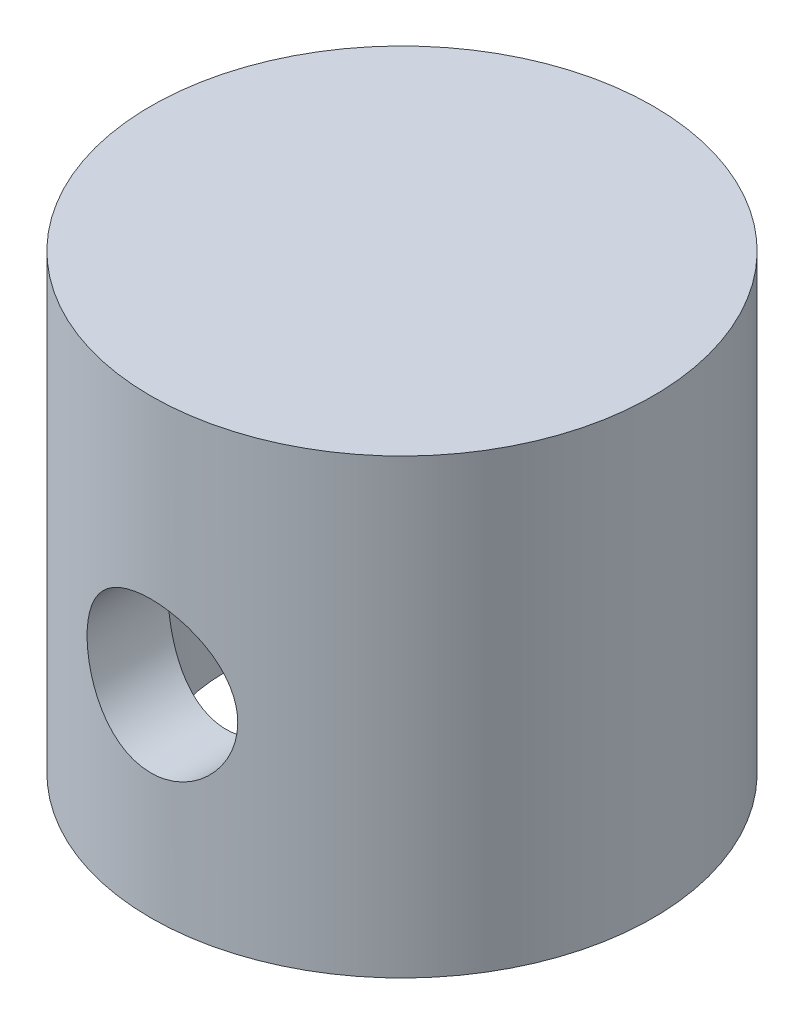
ISO-10303-21;
HEADER;
FILE_DESCRIPTION(('STEP AP214'),'2;1');
FILE_NAME('part.step','',(''),(''),'','','');
FILE_SCHEMA(('AUTOMOTIVE_DESIGN { 1 0 10303 214 1 1 1 1 }'));
ENDSEC;
DATA;
#1=APPLICATION_CONTEXT('core data for automotive mechanical design processes');
#2=APPLICATION_PROTOCOL_DEFINITION('international standard','automotive_design',2000,#1);
#3=PRODUCT_CONTEXT('',#1,'mechanical');
#4=PRODUCT('Part','Part','',(#3));
#5=PRODUCT_RELATED_PRODUCT_CATEGORY('part','',(#4));
#6=PRODUCT_DEFINITION_FORMATION('','',#4);
#7=PRODUCT_DEFINITION_CONTEXT('part definition',#1,'design');
#8=PRODUCT_DEFINITION('design','',#6,#7);
#9=PRODUCT_DEFINITION_SHAPE('','',#8);
#10=(LENGTH_UNIT() NAMED_UNIT(*) SI_UNIT(.MILLI.,.METRE.));
#11=(NAMED_UNIT(*) PLANE_ANGLE_UNIT() SI_UNIT($,.RADIAN.));
#12=(NAMED_UNIT(*) SI_UNIT($,.STERADIAN.) SOLID_ANGLE_UNIT());
#13=UNCERTAINTY_MEASURE_WITH_UNIT(LENGTH_MEASURE(1.E-05),#10,'distance_accuracy_value','');
#14=(GEOMETRIC_REPRESENTATION_CONTEXT(3) GLOBAL_UNCERTAINTY_ASSIGNED_CONTEXT((#13)) GLOBAL_UNIT_ASSIGNED_CONTEXT((#10,
#11,#12)) REPRESENTATION_CONTEXT('',''));
#15=CARTESIAN_POINT('',(0.,0.,0.));
#16=DIRECTION('',(0.,0.,1.));
#17=DIRECTION('',(1.,0.,0.));
#18=AXIS2_PLACEMENT_3D('',#15,#16,#17);
#19=CARTESIAN_POINT('',(0.,18.,0.));
#20=DIRECTION('',(0.,-1.,0.));
#21=DIRECTION('',(0.,0.,-1.));
#22=AXIS2_PLACEMENT_3D('',#19,#20,#21);
#23=CYLINDRICAL_SURFACE('',#22,10.);
#24=CARTESIAN_POINT('',(0.,11.,-10.));
#25=CARTESIAN_POINT('',(-0.1645772255066,10.9999980050302,-9.999998585011));
#26=CARTESIAN_POINT('',(-0.329174636703059,10.9864122727521,-9.99589831387907));
#27=CARTESIAN_POINT('',(-0.653576250609762,10.9325572915558,-9.97994211187381));
#28=CARTESIAN_POINT('',(-0.81337900882284,10.8922800839533,-9.96808386779384));
#29=CARTESIAN_POINT('',(-1.12346541550905,10.7865079661795,-9.93791105003673));
#30=CARTESIAN_POINT('',(-1.27376272879075,10.7210502607621,-9.91960600500851));
#31=CARTESIAN_POINT('',(-1.56124836210626,10.5669278138883,-9.8784421847529));
#32=CARTESIAN_POINT('',(-1.69843493493934,10.4782599852092,-9.85558280384133));
#33=CARTESIAN_POINT('',(-1.95974359436749,10.2775519850547,-9.80701474385548));
#34=CARTESIAN_POINT('',(-2.08343614248868,10.1649667482282,-9.78124767314073));
#35=CARTESIAN_POINT('',(-2.31049841846647,9.92078154017963,-9.73011668420884));
#36=CARTESIAN_POINT('',(-2.41386472654882,9.78917837575008,-9.70475283449002));
#37=CARTESIAN_POINT('',(-2.59960075447415,9.50705849392478,-9.65668227987544));
#38=CARTESIAN_POINT('',(-2.68144618044427,9.35618307801853,-9.63404813327749));
#39=CARTESIAN_POINT('',(-2.81842789549521,9.04202149153942,-9.59487240788062));
#40=CARTESIAN_POINT('',(-2.87357059839947,8.87873831214405,-9.57832936626621));
#41=CARTESIAN_POINT('',(-2.95403267365303,8.54921946773908,-9.55381741676868));
#42=CARTESIAN_POINT('',(-2.98014392469355,8.38319451227211,-9.54562138649066));
#43=CARTESIAN_POINT('',(-3.00427461229344,8.04893368756647,-9.53805579499534));
#44=CARTESIAN_POINT('',(-3.00230085522157,7.88069836388182,-9.53868409521142));
#45=CARTESIAN_POINT('',(-2.97093954399623,7.55323218278303,-9.54849488135555));
#46=CARTESIAN_POINT('',(-2.9425441052537,7.39389549927552,-9.55736777198281));
#47=CARTESIAN_POINT('',(-2.86074840854112,7.08236042745308,-9.58216712457248));
#48=CARTESIAN_POINT('',(-2.80734568283282,6.93016274525133,-9.59809428264701));
#49=CARTESIAN_POINT('',(-2.67632053307363,6.63479930067852,-9.63545466149946));
#50=CARTESIAN_POINT('',(-2.59837633869285,6.49178583208948,-9.65696032231904));
#51=CARTESIAN_POINT('',(-2.42070445177367,6.22053595597962,-9.70301974000129));
#52=CARTESIAN_POINT('',(-2.32097148005177,6.09230314117245,-9.72757423493982));
#53=CARTESIAN_POINT('',(-2.09762581531093,5.84862761847596,-9.77822022595874));
#54=CARTESIAN_POINT('',(-1.97318981493395,5.73394267194066,-9.80433308620995));
#55=CARTESIAN_POINT('',(-1.70652651862793,5.5268920318715,-9.85424488126517));
#56=CARTESIAN_POINT('',(-1.56429810372178,5.43452774317115,-9.8780436703682));
#57=CARTESIAN_POINT('',(-1.26471007668561,5.27428015507054,-9.92086320138941));
#58=CARTESIAN_POINT('',(-1.1072554994959,5.20656496750028,-9.93985087336628));
#59=CARTESIAN_POINT('',(-0.782490831207038,5.09880081980074,-9.97067043664444));
#60=CARTESIAN_POINT('',(-0.615183503179163,5.05874414293502,-9.98250432373999));
#61=CARTESIAN_POINT('',(-0.281904485336663,5.00869564420121,-9.99736729287077));
#62=CARTESIAN_POINT('',(-0.116100195202373,4.99767682839678,-10.0006970083558));
#63=CARTESIAN_POINT('',(0.214999211646767,5.00313831142416,-9.99905846483519));
#64=CARTESIAN_POINT('',(0.380294393381562,5.01961493930288,-9.99409131355514));
#65=CARTESIAN_POINT('',(0.701807210619394,5.07876922222299,-9.97661393974324));
#66=CARTESIAN_POINT('',(0.858145545228338,5.12084677516174,-9.96427659598828));
#67=CARTESIAN_POINT('',(1.16150927790904,5.2292864655564,-9.9334869568307));
#68=CARTESIAN_POINT('',(1.30853355405117,5.29565152207572,-9.91503392642187));
#69=CARTESIAN_POINT('',(1.5928743789221,5.45250633096227,-9.87339308702631));
#70=CARTESIAN_POINT('',(1.72988765239934,5.54351868189596,-9.8501056165928));
#71=CARTESIAN_POINT('',(1.9870466159603,5.74644950810561,-9.80146937528704));
#72=CARTESIAN_POINT('',(2.10718806471188,5.8583732237753,-9.77612008862419));
#73=CARTESIAN_POINT('',(2.33171489102052,6.10477461673874,-9.72506343738006));
#74=CARTESIAN_POINT('',(2.43536962463001,6.23992375154365,-9.69937650065513));
#75=CARTESIAN_POINT('',(2.61857990144313,6.52625587802689,-9.65153030477949));
#76=CARTESIAN_POINT('',(2.69813607658965,6.67743844911576,-9.62937095313121));
#77=CARTESIAN_POINT('',(2.83034694254316,6.99106498251004,-9.5913437922631));
#78=CARTESIAN_POINT('',(2.88312693874022,7.15345237307567,-9.575446756735));
#79=CARTESIAN_POINT('',(2.96043461630306,7.48537593786047,-9.55183188739737));
#80=CARTESIAN_POINT('',(2.98497197957849,7.65490964156607,-9.54411125069387));
#81=CARTESIAN_POINT('',(3.0044396896993,7.98872303677684,-9.53799944941558));
#82=CARTESIAN_POINT('',(3.00056110615887,8.15292730209885,-9.53923294700394));
#83=CARTESIAN_POINT('',(2.9661501088861,8.47822820680123,-9.54998802392188));
#84=CARTESIAN_POINT('',(2.93561876249407,8.63932497036103,-9.55950927135902));
#85=CARTESIAN_POINT('',(2.84953777608686,8.95189079826335,-9.58551527389243));
#86=CARTESIAN_POINT('',(2.79430351014248,9.10345457471739,-9.60191209104934));
#87=CARTESIAN_POINT('',(2.66063014242147,9.39528487764145,-9.63980557805265));
#88=CARTESIAN_POINT('',(2.58218659925722,9.53554923528315,-9.6613032238508));
#89=CARTESIAN_POINT('',(2.40097527610175,9.80632623305253,-9.70795352855338));
#90=CARTESIAN_POINT('',(2.29742552185996,9.93629752252037,-9.7332108032858));
#91=CARTESIAN_POINT('',(2.07034869259555,10.1774049966162,-9.78402640899066));
#92=CARTESIAN_POINT('',(1.94681643426898,10.2885362789356,-9.80958481647543));
#93=CARTESIAN_POINT('',(1.67893152436652,10.4920468245899,-9.85901873141573));
#94=CARTESIAN_POINT('',(1.53407577158122,10.5837828937109,-9.88282319531421));
#95=CARTESIAN_POINT('',(1.23028274796705,10.7414703398081,-9.92521360911553));
#96=CARTESIAN_POINT('',(1.07135210599791,10.807433776549,-9.94380199862114));
#97=CARTESIAN_POINT('',(0.761515425310563,10.9057905513055,-9.97204349938618));
#98=CARTESIAN_POINT('',(0.611573923908468,10.9410233457665,-9.98244054762139));
#99=CARTESIAN_POINT('',(0.307760390461558,10.9881270504832,-9.9964188898898));
#100=CARTESIAN_POINT('',(0.153889019716279,11.0000018654096,-10.0000013230948));
#101=CARTESIAN_POINT('',(0.,11.,-10.));
#102=B_SPLINE_CURVE_WITH_KNOTS('',3,(#24,#25,#26,#27,#28,#29,#30,#31,#32,#33,#34,#35,#36,#37,
#38,#39,#40,#41,#42,#43,#44,#45,#46,#47,#48,#49,#50,#51,#52,#53,#54,#55,#56,#57,#58,#59,#60,#61,
#62,#63,#64,#65,#66,#67,#68,#69,#70,#71,#72,#73,#74,#75,#76,#77,#78,#79,#80,#81,#82,#83,#84,#85,
#86,#87,#88,#89,#90,#91,#92,#93,#94,#95,#96,#97,#98,#99,#100,#101),.UNSPECIFIED.,.T.,.F.,(4,2,2,
2,2,2,2,2,2,2,2,2,2,2,2,2,2,2,2,2,2,2,2,2,2,2,2,2,2,2,2,2,2,2,2,2,2,2,4),(0.,0.493166407225221,
0.986479929691999,1.47906735260175,1.9717203288254,2.47711205896383,2.98258874577266,
3.49942962008218,4.01614629086447,4.51839378713198,5.02051956638179,5.50452033395352,
5.98856887316002,6.47924852894239,6.97004720317111,7.48134208096333,7.99266913062143,
8.50742093763377,9.02202907057615,9.5181761887709,10.0142570710065,10.4991349336465,
10.9840710918746,11.4802261140582,11.9765056400038,12.4908080064564,13.0050968850536,
13.516956299025,14.0286401892057,14.5190031093854,15.0093463933232,15.4936008081456,
15.9779479511534,16.4799385136898,16.9820594980413,17.4988599232246,18.0154182319959,
18.4766338387004,18.9377723390687),.UNSPECIFIED.);
#103=CARTESIAN_POINT('',(0.,11.,-10.));
#104=VERTEX_POINT('',#103);
#105=EDGE_CURVE('E99',#104,#104,#102,.T.);
#106=ORIENTED_EDGE('',*,*,#105,.T.);
#107=EDGE_LOOP('',(#106));
#108=FACE_BOUND('',#107,.T.);
#109=CARTESIAN_POINT('',(3.,8.,9.53939201416945));
#110=CARTESIAN_POINT('',(2.99999795267528,7.83561090411519,9.5393937145396));
#111=CARTESIAN_POINT('',(2.98644216334284,7.67120155171195,9.54368780418137));
#112=CARTESIAN_POINT('',(2.93271688893498,7.34718950081611,9.56033156605799));
#113=CARTESIAN_POINT('',(2.89253851147156,7.18758842699707,9.57268392986936));
#114=CARTESIAN_POINT('',(2.78705506539911,6.87793054345654,9.60392204971265));
#115=CARTESIAN_POINT('',(2.72179178788487,6.72785834073383,9.62279693406464));
#116=CARTESIAN_POINT('',(2.56812843835858,6.4407561320094,9.66493865095134));
#117=CARTESIAN_POINT('',(2.47972490274105,6.30372808263112,9.68820614082039));
#118=CARTESIAN_POINT('',(2.27929508283254,6.04226721884525,9.73733724371531));
#119=CARTESIAN_POINT('',(2.16666414351613,5.91830820410743,9.76325616623271));
#120=CARTESIAN_POINT('',(1.9222724751592,5.69072409735498,9.81429723873514));
#121=CARTESIAN_POINT('',(1.79050929092222,5.58710161910024,9.8394192859541));
#122=CARTESIAN_POINT('',(1.50822287558738,5.40107460033339,9.88666429158777));
#123=CARTESIAN_POINT('',(1.35736804267163,5.31915315111438,9.90871448684808));
#124=CARTESIAN_POINT('',(1.04324929073871,5.18202548191449,9.94668871841369));
#125=CARTESIAN_POINT('',(0.879988056775823,5.1268135002851,9.96261407578991));
#126=CARTESIAN_POINT('',(0.55064770526166,5.04623999781898,9.98615292007177));
#127=CARTESIAN_POINT('',(0.384782797907604,5.02006974469459,9.99399114738673));
#128=CARTESIAN_POINT('',(0.0508436474986284,4.99576535070712,10.001264030027));
#129=CARTESIAN_POINT('',(-0.117230124100743,4.99762532119609,10.0007004504217));
#130=CARTESIAN_POINT('',(-0.445142313200314,5.02878573708604,9.99139207635305));
#131=CARTESIAN_POINT('',(-0.60507253528266,5.0572103876197,9.98290840410475));
#132=CARTESIAN_POINT('',(-0.917778426885076,5.13926267198862,9.95903044225231));
#133=CARTESIAN_POINT('',(-1.07055364264578,5.1928919018855,9.9436357150134));
#134=CARTESIAN_POINT('',(-1.36669465270248,5.32442404683696,9.90730441973756));
#135=CARTESIAN_POINT('',(-1.50993012938864,5.40260240561395,9.88630539352772));
#136=CARTESIAN_POINT('',(-1.78152934756663,5.58079570485705,9.84099281296777));
#137=CARTESIAN_POINT('',(-1.90988954974545,5.68081582592917,9.81667847277943));
#138=CARTESIAN_POINT('',(-2.15332096305837,5.9043955015009,9.76623100973852));
#139=CARTESIAN_POINT('',(-2.26768916079755,6.02871383805078,9.74006390633502));
#140=CARTESIAN_POINT('',(-2.47415303080115,6.2950200357888,9.68967959784414));
#141=CARTESIAN_POINT('',(-2.56624648967452,6.43700965081097,9.66546258669242));
#142=CARTESIAN_POINT('',(-2.72627990669511,6.73647893847217,9.62155806359712));
#143=CARTESIAN_POINT('',(-2.79397978469378,6.89409409161749,9.6019162125849));
#144=CARTESIAN_POINT('',(-2.90166725750739,7.2192144167786,9.5699278496379));
#145=CARTESIAN_POINT('',(-2.94166389279494,7.38671634303506,9.55757895796639));
#146=CARTESIAN_POINT('',(-2.99149540565762,7.72016472150244,9.54209699116239));
#147=CARTESIAN_POINT('',(-3.00239892760807,7.88593644779436,9.53863757349917));
#148=CARTESIAN_POINT('',(-2.99671894465741,8.21694580001334,9.54042384874812));
#149=CARTESIAN_POINT('',(-2.98013928742559,8.38218349746,9.54566832310786));
#150=CARTESIAN_POINT('',(-2.92091527148479,8.70297675594339,9.56395117112153));
#151=CARTESIAN_POINT('',(-2.87895922862587,8.85867232852749,9.57678353015602));
#152=CARTESIAN_POINT('',(-2.77097155495853,9.16080338162939,9.6085828246183));
#153=CARTESIAN_POINT('',(-2.70493620685512,9.30723742828102,9.62755070717977));
#154=CARTESIAN_POINT('',(-2.54863742393008,9.59103492814438,9.67011670046268));
#155=CARTESIAN_POINT('',(-2.4577712834546,9.72804944197162,9.69382542139644));
#156=CARTESIAN_POINT('',(-2.25510603200767,9.98527621236157,9.74296411293927));
#157=CARTESIAN_POINT('',(-2.14330191069793,10.1054844352256,9.76839449459993));
#158=CARTESIAN_POINT('',(-1.8969102649872,10.3303608116295,9.81927267096329));
#159=CARTESIAN_POINT('',(-1.76162213171487,10.434271257974,9.84468490126011));
#160=CARTESIAN_POINT('',(-1.4749235691805,10.6179334020555,9.89169703497297));
#161=CARTESIAN_POINT('',(-1.32351394108789,10.6976862995629,9.91329712769433));
#162=CARTESIAN_POINT('',(-1.00987100941044,10.8300000611366,9.95011940949915));
#163=CARTESIAN_POINT('',(-0.847729244075677,10.882764032318,9.96538906849931));
#164=CARTESIAN_POINT('',(-0.516339933009175,10.9601218377808,9.98803959193653));
#165=CARTESIAN_POINT('',(-0.347094434709525,10.9847237318968,9.9954227134176));
#166=CARTESIAN_POINT('',(-0.0133043077654862,11.004446088109,10.001330881628));
#167=CARTESIAN_POINT('',(0.151170358172413,11.0006653908157,10.0001861022264));
#168=CARTESIAN_POINT('',(0.477038962328807,10.9663567350018,9.98994528930073));
#169=CARTESIAN_POINT('',(0.638433074693057,10.9358302930391,9.98084970660925));
#170=CARTESIAN_POINT('',(0.951871626082716,10.8495766772007,9.95582336716653));
#171=CARTESIAN_POINT('',(1.10399785470278,10.794123638702,9.93996705801731));
#172=CARTESIAN_POINT('',(1.39686647550411,10.6598361709856,9.90305886078899));
#173=CARTESIAN_POINT('',(1.53760699210116,10.5809978994276,9.88200611899892));
#174=CARTESIAN_POINT('',(1.80860378484113,10.3992530851399,9.83607931656456));
#175=CARTESIAN_POINT('',(1.93838050015353,10.2956571399985,9.81110453847118));
#176=CARTESIAN_POINT('',(2.17907514269189,10.0685792233344,9.76047074424667));
#177=CARTESIAN_POINT('',(2.28998761920387,9.9450915242037,9.73481153282158));
#178=CARTESIAN_POINT('',(2.49312538789097,9.67731844337898,9.68481361262638));
#179=CARTESIAN_POINT('',(2.58469519515913,9.53252289321913,9.6605370538697));
#180=CARTESIAN_POINT('',(2.74208627057551,9.22888965167796,9.61705095017586));
#181=CARTESIAN_POINT('',(2.80791991114577,9.07005875279761,9.59783897193911));
#182=CARTESIAN_POINT('',(2.90603885065899,8.76051913678745,9.56855633435189));
#183=CARTESIAN_POINT('',(2.94117718022463,8.61078270613801,9.5577230968104));
#184=CARTESIAN_POINT('',(2.98815637670288,8.30736955500845,9.54314085194333));
#185=CARTESIAN_POINT('',(3.00000191412191,8.1536936307095,9.53939042442861));
#186=CARTESIAN_POINT('',(3.,8.,9.53939201416945));
#187=B_SPLINE_CURVE_WITH_KNOTS('',3,(#109,#110,#111,#112,#113,#114,#115,#116,#117,#118,#119,
#120,#121,#122,#123,#124,#125,#126,#127,#128,#129,#130,#131,#132,#133,#134,#135,#136,#137,#138,
#139,#140,#141,#142,#143,#144,#145,#146,#147,#148,#149,#150,#151,#152,#153,#154,#155,#156,#157,
#158,#159,#160,#161,#162,#163,#164,#165,#166,#167,#168,#169,#170,#171,#172,#173,#174,#175,#176,
#177,#178,#179,#180,#181,#182,#183,#184,#185,#186),.UNSPECIFIED.,.T.,.F.,(4,2,2,2,2,2,2,2,2,2,2,
2,2,2,2,2,2,2,2,2,2,2,2,2,2,2,2,2,2,2,2,2,2,2,2,2,2,2,4),(0.,0.492600331831084,
0.985365283377999,1.47731282893239,1.9693340507402,2.47546300015968,2.98165695742546,
3.49831878547289,4.01486911175754,4.51664280299115,5.01831108202881,5.5040025198176,
5.98972471780752,6.48110418671353,6.97260033181661,7.48304294046556,7.99353624983726,
8.50892476494934,9.02414501262032,9.52016161585828,10.0161087821998,10.4991718988284,
10.9823096209678,11.4784146362399,11.9746385186305,12.4895901220641,13.0045161465361,
13.5155078363386,14.0263532464857,14.5175260782765,15.0086710610072,15.4945419374965,
15.9804926898797,16.4819925411419,16.9836370526499,17.500232793435,18.016579879331,
18.477223077201,18.9377739007233),.UNSPECIFIED.);
#188=CARTESIAN_POINT('',(3.,8.,9.53939201416945));
#189=VERTEX_POINT('',#188);
#190=EDGE_CURVE('E74',#189,#189,#187,.T.);
#191=ORIENTED_EDGE('',*,*,#190,.T.);
#192=EDGE_LOOP('',(#191));
#193=FACE_BOUND('',#192,.T.);
#194=CARTESIAN_POINT('',(0.,18.,0.));
#195=DIRECTION('',(0.,1.,0.));
#196=DIRECTION('',(0.,0.,1.));
#197=AXIS2_PLACEMENT_3D('',#194,#195,#196);
#198=CIRCLE('',#197,10.);
#199=CARTESIAN_POINT('',(0.,18.,10.));
#200=VERTEX_POINT('',#199);
#201=EDGE_CURVE('E59',#200,#200,#198,.T.);
#202=ORIENTED_EDGE('',*,*,#201,.F.);
#203=EDGE_LOOP('',(#202));
#204=FACE_BOUND('',#203,.T.);
#205=CARTESIAN_POINT('',(0.,0.,0.));
#206=DIRECTION('',(0.,1.,0.));
#207=DIRECTION('',(0.,0.,1.));
#208=AXIS2_PLACEMENT_3D('',#205,#206,#207);
#209=CIRCLE('',#208,10.);
#210=CARTESIAN_POINT('',(0.,0.,10.));
#211=VERTEX_POINT('',#210);
#212=EDGE_CURVE('E63',#211,#211,#209,.T.);
#213=ORIENTED_EDGE('',*,*,#212,.T.);
#214=EDGE_LOOP('',(#213));
#215=FACE_BOUND('',#214,.T.);
#216=ADVANCED_FACE('F48',(#108,#193,#204,#215),#23,.T.);
#217=CARTESIAN_POINT('',(0.,18.,0.));
#218=DIRECTION('',(0.,1.,0.));
#219=DIRECTION('',(0.,0.,1.));
#220=AXIS2_PLACEMENT_3D('',#217,#218,#219);
#221=PLANE('',#220);
#222=ORIENTED_EDGE('',*,*,#201,.T.);
#223=EDGE_LOOP('',(#222));
#224=FACE_BOUND('',#223,.T.);
#225=ADVANCED_FACE('F107',(#224),#221,.T.);
#226=CARTESIAN_POINT('',(0.,0.,0.));
#227=DIRECTION('',(0.,1.,0.));
#228=DIRECTION('',(0.,0.,1.));
#229=AXIS2_PLACEMENT_3D('',#226,#227,#228);
#230=PLANE('',#229);
#231=CARTESIAN_POINT('',(0.,0.,0.));
#232=DIRECTION('',(0.,-1.,0.));
#233=DIRECTION('',(0.,0.,-1.));
#234=AXIS2_PLACEMENT_3D('',#231,#232,#233);
#235=CIRCLE('',#234,7.);
#236=CARTESIAN_POINT('',(0.,0.,-7.));
#237=VERTEX_POINT('',#236);
#238=EDGE_CURVE('E123',#237,#237,#235,.T.);
#239=ORIENTED_EDGE('',*,*,#238,.F.);
#240=EDGE_LOOP('',(#239));
#241=FACE_BOUND('',#240,.T.);
#242=ORIENTED_EDGE('',*,*,#212,.F.);
#243=EDGE_LOOP('',(#242));
#244=FACE_BOUND('',#243,.T.);
#245=ADVANCED_FACE('F109',(#241,#244),#230,.F.);
#246=CARTESIAN_POINT('',(0.,15.,0.));
#247=DIRECTION('',(0.,-1.,0.));
#248=DIRECTION('',(0.,0.,-1.));
#249=AXIS2_PLACEMENT_3D('',#246,#247,#248);
#250=CYLINDRICAL_SURFACE('',#249,7.);
#251=CARTESIAN_POINT('',(0.,14.,0.));
#252=DIRECTION('',(0.,-1.,0.));
#253=DIRECTION('',(0.,0.,-1.));
#254=AXIS2_PLACEMENT_3D('',#251,#252,#253);
#255=CIRCLE('',#254,7.);
#256=CARTESIAN_POINT('',(0.,14.,-7.));
#257=VERTEX_POINT('',#256);
#258=EDGE_CURVE('E12',#257,#257,#255,.F.);
#259=ORIENTED_EDGE('',*,*,#258,.T.);
#260=EDGE_LOOP('',(#259));
#261=FACE_BOUND('',#260,.T.);
#262=CARTESIAN_POINT('',(0.,11.,-7.));
#263=CARTESIAN_POINT('',(0.160281740269091,10.9999925304185,-6.9999940839629));
#264=CARTESIAN_POINT('',(0.320833907522429,10.9870786839035,-6.99443250051265));
#265=CARTESIAN_POINT('',(0.637349314958984,10.9359176345735,-6.97273920628719));
#266=CARTESIAN_POINT('',(0.793299928144206,10.8976064709267,-6.95658080950724));
#267=CARTESIAN_POINT('',(1.0955347051483,10.7973302363749,-6.91541630739346));
#268=CARTESIAN_POINT('',(1.24185033642246,10.7354471561946,-6.89044089228941));
#269=CARTESIAN_POINT('',(1.5218733278968,10.5901355814363,-6.83405660276648));
#270=CARTESIAN_POINT('',(1.65558409053381,10.5067129239082,-6.80264947176647));
#271=CARTESIAN_POINT('',(1.91384144205639,10.3160723523121,-6.7346782187555));
#272=CARTESIAN_POINT('',(2.03764045493602,10.2079047401042,-6.69793895962371));
#273=CARTESIAN_POINT('',(2.26599040232609,9.97285613149922,-6.62417654338771));
#274=CARTESIAN_POINT('',(2.3705306503261,9.84596481539728,-6.5871532404671));
#275=CARTESIAN_POINT('',(2.56285686126492,9.5689672772845,-6.51482055271223));
#276=CARTESIAN_POINT('',(2.64946811752636,9.41798954197069,-6.47970460244924));
#277=CARTESIAN_POINT('',(2.79573199408101,9.10189057181104,-6.41796168635027));
#278=CARTESIAN_POINT('',(2.8553992914263,8.93677709551375,-6.39133010120133));
#279=CARTESIAN_POINT('',(2.94294919918374,8.60569926169076,-6.35147799087276));
#280=CARTESIAN_POINT('',(2.97227494401776,8.44019229822055,-6.3376522143554));
#281=CARTESIAN_POINT('',(3.00280607158394,8.10607403038965,-6.32324849688131));
#282=CARTESIAN_POINT('',(3.00402828615096,7.93746464470862,-6.32266262625149));
#283=CARTESIAN_POINT('',(2.97939999510613,7.61670009628145,-6.33429573902539));
#284=CARTESIAN_POINT('',(2.95576113815072,7.46432937666801,-6.34546870930158));
#285=CARTESIAN_POINT('',(2.88580772808799,7.16597241409867,-6.37758411517576));
#286=CARTESIAN_POINT('',(2.83948852833539,7.01998748611386,-6.39852855266591));
#287=CARTESIAN_POINT('',(2.72457659070691,6.73475284856477,-6.44830685655465));
#288=CARTESIAN_POINT('',(2.65551974428426,6.59571970578186,-6.47730295111391));
#289=CARTESIAN_POINT('',(2.49742304873013,6.33065367593057,-6.53988493882129));
#290=CARTESIAN_POINT('',(2.40837507480489,6.20462610507051,-6.57347269593628));
#291=CARTESIAN_POINT('',(2.20343405392229,5.95722249637862,-6.64512404535213));
#292=CARTESIAN_POINT('',(2.08584728856133,5.83728327052803,-6.68331855389209));
#293=CARTESIAN_POINT('',(1.83187332405077,5.61832840934405,-6.75734605758523));
#294=CARTESIAN_POINT('',(1.6954812162799,5.51931825412179,-6.79317843254652));
#295=CARTESIAN_POINT('',(1.40318582301271,5.34275606719303,-6.8595969368957));
#296=CARTESIAN_POINT('',(1.24687114970231,5.26582098129442,-6.89002455033727));
#297=CARTESIAN_POINT('',(0.921879694158935,5.13984976238528,-6.94097396260558));
#298=CARTESIAN_POINT('',(0.753210215657665,5.0907972940223,-6.96150156039981));
#299=CARTESIAN_POINT('',(0.420276238941369,5.02506613954103,-6.98923526893385));
#300=CARTESIAN_POINT('',(0.256457961010924,5.00646123468561,-6.99723249964589));
#301=CARTESIAN_POINT('',(-0.0721433011185079,4.99637042359177,-7.00155416651738));
#302=CARTESIAN_POINT('',(-0.236925971900557,5.00487614746763,-6.99788220531666));
#303=CARTESIAN_POINT('',(-0.553542439626672,5.04741563205481,-6.9797867632015));
#304=CARTESIAN_POINT('',(-0.705598931504217,5.08006832144833,-6.96594519473644));
#305=CARTESIAN_POINT('',(-1.00189113639242,5.16802089423816,-6.92953888009974));
#306=CARTESIAN_POINT('',(-1.14612587370002,5.22332359572216,-6.90697304848521));
#307=CARTESIAN_POINT('',(-1.42777696523888,5.35680115950212,-6.8543875151372));
#308=CARTESIAN_POINT('',(-1.56483974951837,5.43563633022606,-6.82415705388474));
#309=CARTESIAN_POINT('',(-1.82428490564705,5.61321894447594,-6.75942988391438));
#310=CARTESIAN_POINT('',(-1.94666097512992,5.71197488802329,-6.72493135648758));
#311=CARTESIAN_POINT('',(-2.18296759532595,5.9352895878429,-6.65214788697903));
#312=CARTESIAN_POINT('',(-2.29556617553686,6.06123221006139,-6.61377354998591));
#313=CARTESIAN_POINT('',(-2.49843431443676,6.33078229863161,-6.53984037690252));
#314=CARTESIAN_POINT('',(-2.58869766421195,6.47439466037483,-6.50428232556792));
#315=CARTESIAN_POINT('',(-2.74563875632303,6.77881385295857,-6.4396296928532));
#316=CARTESIAN_POINT('',(-2.81186415020233,6.93988300904999,-6.41066255987443));
#317=CARTESIAN_POINT('',(-2.91565885028324,7.2725263267395,-6.36413607530145));
#318=CARTESIAN_POINT('',(-2.95325364225748,7.44409099832457,-6.346566580073));
#319=CARTESIAN_POINT('',(-2.9961194841997,7.77799117233295,-6.32643481136621));
#320=CARTESIAN_POINT('',(-3.00374693238451,7.93995926751059,-6.3227792566546));
#321=CARTESIAN_POINT('',(-2.99282649265778,8.2627897469115,-6.32795618271386));
#322=CARTESIAN_POINT('',(-2.97428322126543,8.42365232111928,-6.33678646098226));
#323=CARTESIAN_POINT('',(-2.91356431394149,8.73104169627336,-6.3649165389077));
#324=CARTESIAN_POINT('',(-2.87266975661121,8.87787879157075,-6.38364713099396));
#325=CARTESIAN_POINT('',(-2.769702223632,9.16262076608388,-6.42898875831973));
#326=CARTESIAN_POINT('',(-2.70762322652258,9.30052309240773,-6.45560203384715));
#327=CARTESIAN_POINT('',(-2.55963250501149,9.57282070867955,-6.5157524732596));
#328=CARTESIAN_POINT('',(-2.47248232196069,9.70646915369476,-6.5496164957701));
#329=CARTESIAN_POINT('',(-2.2784960092513,9.95798236124753,-6.61959778926566));
#330=CARTESIAN_POINT('',(-2.17165243666714,10.0758411270492,-6.6557159087398));
#331=CARTESIAN_POINT('',(-1.93135048700133,10.3020036355007,-6.72955424641834));
#332=CARTESIAN_POINT('',(-1.79645724733279,10.4088195655728,-6.76717599448736));
#333=CARTESIAN_POINT('',(-1.50919760355001,10.5984397600312,-6.83696477009089));
#334=CARTESIAN_POINT('',(-1.35682332068822,10.6812331375999,-6.86912932173673));
#335=CARTESIAN_POINT('',(-1.11954532843042,10.7845926909895,-6.91035442086788));
#336=CARTESIAN_POINT('',(-1.03957288024831,10.8154332908018,-6.92286397965452));
#337=CARTESIAN_POINT('',(-0.876970802782695,10.8702382020223,-6.94533202163241));
#338=CARTESIAN_POINT('',(-0.794342461515165,10.8942057922754,-6.95529172101821));
#339=CARTESIAN_POINT('',(-0.627265567421396,10.9349477172834,-6.97234378079151));
#340=CARTESIAN_POINT('',(-0.542821986677286,10.9517395843805,-6.97944312738119));
#341=CARTESIAN_POINT('',(-0.372647906839315,10.9780087142034,-6.99059319635283));
#342=CARTESIAN_POINT('',(-0.286918376030205,10.9874912240139,-6.99464610559385));
#343=CARTESIAN_POINT('',(-0.167492669563776,10.9955082749436,-6.99807592564235));
#344=CARTESIAN_POINT('',(-0.134021137958667,10.9971918541176,-6.99879677015532));
#345=CARTESIAN_POINT('',(-0.0670370145842116,10.9994385012841,-6.99975942751561));
#346=CARTESIAN_POINT('',(-0.0335244225617061,11.0000015623327,-7.0000012373944));
#347=CARTESIAN_POINT('',(0.,11.,-7.));
#348=B_SPLINE_CURVE_WITH_KNOTS('',3,(#262,#263,#264,#265,#266,#267,#268,#269,#270,#271,#272,
#273,#274,#275,#276,#277,#278,#279,#280,#281,#282,#283,#284,#285,#286,#287,#288,#289,#290,#291,
#292,#293,#294,#295,#296,#297,#298,#299,#300,#301,#302,#303,#304,#305,#306,#307,#308,#309,#310,
#311,#312,#313,#314,#315,#316,#317,#318,#319,#320,#321,#322,#323,#324,#325,#326,#327,#328,#329,
#330,#331,#332,#333,#334,#335,#336,#337,#338,#339,#340,#341,#342,#343,#344,#345,#346,#347),
.UNSPECIFIED.,.T.,.F.,(4,2,2,2,2,2,2,2,2,2,2,2,2,2,2,2,2,2,2,2,2,2,2,2,2,2,2,2,2,2,2,2,2,2,2,2,
2,2,2,2,2,2,4),(0.,0.480714322748849,0.962643903423346,1.44291226275142,1.92305060961531,
2.42622743558506,2.92968263421744,3.45969560860062,3.98941952228263,4.492594268281,
4.99546764377915,5.45710720323576,5.91884138089948,6.3906540887232,6.86265889892285,
7.37709837725841,7.89167239108963,8.41947244601234,8.94696296364742,9.43957347502028,
9.93203191709569,10.3983119423363,10.8646499992176,11.3455505516221,11.8266567358409,
12.3440285038672,12.8615439335848,13.3883469079738,13.9146803943342,14.3986848887267,
14.882604015318,15.341320451094,15.8001673810816,16.2874475008663,16.7749121624767,
17.3008416934143,17.8270092002163,18.0865840789243,18.3460349177801,18.6048481685098,
18.8634754544625,18.964020720529,19.0645666096629),.UNSPECIFIED.);
#349=CARTESIAN_POINT('',(0.,11.,-7.));
#350=VERTEX_POINT('',#349);
#351=EDGE_CURVE('E66',#350,#350,#348,.T.);
#352=ORIENTED_EDGE('',*,*,#351,.T.);
#353=EDGE_LOOP('',(#352));
#354=FACE_BOUND('',#353,.T.);
#355=CARTESIAN_POINT('',(3.,8.,6.32455532033676));
#356=CARTESIAN_POINT('',(2.99999904512121,8.07980076303089,6.32455623917925));
#357=CARTESIAN_POINT('',(2.99680914186365,8.15963081997055,6.32607259589376));
#358=CARTESIAN_POINT('',(2.98409481890062,8.31868689095485,6.33207844610818));
#359=CARTESIAN_POINT('',(2.97456636476115,8.39791248776008,6.33656983318198));
#360=CARTESIAN_POINT('',(2.93654933365817,8.63408902654329,6.35433138320313));
#361=CARTESIAN_POINT('',(2.8986294210123,8.78931996585725,6.3718883479981));
#362=CARTESIAN_POINT('',(2.79949691759116,9.08987031559865,6.41604959211165));
#363=CARTESIAN_POINT('',(2.73838302089272,9.2352286875862,6.44261548670749));
#364=CARTESIAN_POINT('',(2.59488993442856,9.51362554399775,6.50173461776113));
#365=CARTESIAN_POINT('',(2.51251491871712,9.6466664396721,6.53428667863442));
#366=CARTESIAN_POINT('',(2.32303426891366,9.90545283950425,6.604111083221));
#367=CARTESIAN_POINT('',(2.21474428773221,10.0302862690513,6.64154929418065));
#368=CARTESIAN_POINT('',(1.9789916252315,10.2607018570591,6.71556787556132));
#369=CARTESIAN_POINT('',(1.85152133453084,10.3662763379976,6.75214789882674));
#370=CARTESIAN_POINT('',(1.5737748906695,10.5599192404586,6.82236442416004));
#371=CARTESIAN_POINT('',(1.42271545416052,10.6469492520773,6.85578586283844));
#372=CARTESIAN_POINT('',(1.10640716164424,10.7939641666446,6.91387422205065));
#373=CARTESIAN_POINT('',(0.941164994307304,10.8539617357451,6.93854524147057));
#374=CARTESIAN_POINT('',(0.610764262051987,10.941865036361,6.97517471062289));
#375=CARTESIAN_POINT('',(0.446095117735235,10.9713460690391,6.98775448299434));
#376=CARTESIAN_POINT('',(0.113699399968668,11.0024826967172,7.00104925914407));
#377=CARTESIAN_POINT('',(-0.0540258257506373,11.004150273699,7.00176937203861));
#378=CARTESIAN_POINT('',(-0.376268415183326,10.9804097522089,6.99162033228837));
#379=CARTESIAN_POINT('',(-0.530941438169346,10.9567362003163,6.98149359551672));
#380=CARTESIAN_POINT('',(-0.833871717827573,10.8859759310798,6.95182205628876));
#381=CARTESIAN_POINT('',(-0.982128499493936,10.8388874835014,6.93227655784003));
#382=CARTESIAN_POINT('',(-1.27075797068383,10.7220934103473,6.88526693329208));
#383=CARTESIAN_POINT('',(-1.41097529460903,10.6520527076709,6.85768620781763));
#384=CARTESIAN_POINT('',(-1.67803533028446,10.4916826446237,6.79727675004241));
#385=CARTESIAN_POINT('',(-1.8048732130277,10.4013459954593,6.76444613359548));
#386=CARTESIAN_POINT('',(-2.05154784007322,10.195190493324,6.69393790301249));
#387=CARTESIAN_POINT('',(-2.1701729768624,10.077981130226,6.65608139107459));
#388=CARTESIAN_POINT('',(-2.38662617777592,9.82529716835046,6.58157631342609));
#389=CARTESIAN_POINT('',(-2.48444526456873,9.68981472619326,6.5449282748833));
#390=CARTESIAN_POINT('',(-2.65987942757701,9.39822012552853,6.47566835431169));
#391=CARTESIAN_POINT('',(-2.73662769389096,9.24153585451875,6.44325238173047));
#392=CARTESIAN_POINT('',(-2.86214771894642,8.91571099165666,6.3884939447888));
#393=CARTESIAN_POINT('',(-2.9109408263676,8.74658001674197,6.36614379619967));
#394=CARTESIAN_POINT('',(-2.9759867011968,8.41282720438795,6.33598550498636));
#395=CARTESIAN_POINT('',(-2.99421280080632,8.2486710193927,6.32729797712828));
#396=CARTESIAN_POINT('',(-3.00343131976712,7.91945102489172,6.32292988606605));
#397=CARTESIAN_POINT('',(-2.99443410914468,7.75438758489254,6.32724437007431));
#398=CARTESIAN_POINT('',(-2.9512647841786,7.44013742625656,6.34748143158175));
#399=CARTESIAN_POINT('',(-2.9188846108295,7.29064425962823,6.36257694871081));
#400=CARTESIAN_POINT('',(-2.83228012727602,6.99935452363032,6.40159573000742));
#401=CARTESIAN_POINT('',(-2.77805051059372,6.85755983345552,6.42552113853308));
#402=CARTESIAN_POINT('',(-2.64668378105435,6.57879010970888,6.48076667248579));
#403=CARTESIAN_POINT('',(-2.5686531941561,6.44229267817796,6.51236308247384));
#404=CARTESIAN_POINT('',(-2.39277124314047,6.18364929448871,6.57901833984006));
#405=CARTESIAN_POINT('',(-2.29491096228641,6.06150983780192,6.61407874120977));
#406=CARTESIAN_POINT('',(-2.07211495440809,5.8239710744273,6.68739396565838));
#407=CARTESIAN_POINT('',(-1.94556360485738,5.71008476277624,6.72566111015056));
#408=CARTESIAN_POINT('',(-1.67428466903032,5.5048657627252,6.79826947497518));
#409=CARTESIAN_POINT('',(-1.5295552644811,5.41353533320792,6.83261030191759));
#410=CARTESIAN_POINT('',(-1.2245807874168,5.25591731019293,6.89381439172467));
#411=CARTESIAN_POINT('',(-1.06426298143306,5.1897549537128,6.92064008929576));
#412=CARTESIAN_POINT('',(-0.733319762769438,5.08585020184377,6.96347660484597));
#413=CARTESIAN_POINT('',(-0.562700954301775,5.04808980199162,6.9794942735468));
#414=CARTESIAN_POINT('',(-0.229480384595672,5.00442253984338,6.99808081286415));
#415=CARTESIAN_POINT('',(-0.0672060876467164,4.99638617948059,7.00154837158207));
#416=CARTESIAN_POINT('',(0.256339620951762,5.00659551874034,6.99717401704727));
#417=CARTESIAN_POINT('',(0.417611220908518,5.02483612400403,6.98933429595527));
#418=CARTESIAN_POINT('',(0.728044798339692,5.08555350417255,6.96371224258032));
#419=CARTESIAN_POINT('',(0.877433690400417,5.12705384736548,6.9463310265813));
#420=CARTESIAN_POINT('',(1.16704890744754,5.23201618391979,6.90358200259661));
#421=CARTESIAN_POINT('',(1.30727354037359,5.29548221941568,6.87821272472253));
#422=CARTESIAN_POINT('',(1.58164154030708,5.44578988783599,6.82048100144583));
#423=CARTESIAN_POINT('',(1.71521554911027,5.53356592185351,6.78785230171247));
#424=CARTESIAN_POINT('',(1.96631980223031,5.7286817135381,6.71941601876114));
#425=CARTESIAN_POINT('',(2.08384366642576,5.83602921172949,6.68360718068102));
#426=CARTESIAN_POINT('',(2.30839582375668,6.07638386344314,6.60956029826528));
#427=CARTESIAN_POINT('',(2.41404185093547,6.21068841461896,6.57133471854878));
#428=CARTESIAN_POINT('',(2.60157161791914,6.4963461327278,6.49938146624856));
#429=CARTESIAN_POINT('',(2.68344152863089,6.64770915075983,6.46565641748318));
#430=CARTESIAN_POINT('',(2.78618250414778,6.88438244107628,6.42172587804179));
#431=CARTESIAN_POINT('',(2.81707998873811,6.96485575915902,6.40819457191417));
#432=CARTESIAN_POINT('',(2.87192428390112,7.12851622283208,6.38380411418013));
#433=CARTESIAN_POINT('',(2.89587453038153,7.21170200419124,6.37294364206054));
#434=CARTESIAN_POINT('',(2.93649221837599,7.37993080768133,6.35433014729515));
#435=CARTESIAN_POINT('',(2.9531788427136,7.46496830738197,6.3465689441917));
#436=CARTESIAN_POINT('',(2.97913893233313,7.63636277171286,6.33442493706763));
#437=CARTESIAN_POINT('',(2.9884180785096,7.72271867334121,6.33003954418514));
#438=CARTESIAN_POINT('',(2.99595579124565,7.84106140017636,6.32647229512562));
#439=CARTESIAN_POINT('',(2.99747183035651,7.87282428075995,6.32575401974705));
#440=CARTESIAN_POINT('',(2.99949413311609,7.93638988916856,6.3247953454093));
#441=CARTESIAN_POINT('',(3.00000038060031,7.9681926176233,6.32455495409998));
#442=CARTESIAN_POINT('',(3.,8.,6.32455532033676));
#443=B_SPLINE_CURVE_WITH_KNOTS('',3,(#355,#356,#357,#358,#359,#360,#361,#362,#363,#364,#365,
#366,#367,#368,#369,#370,#371,#372,#373,#374,#375,#376,#377,#378,#379,#380,#381,#382,#383,#384,
#385,#386,#387,#388,#389,#390,#391,#392,#393,#394,#395,#396,#397,#398,#399,#400,#401,#402,#403,
#404,#405,#406,#407,#408,#409,#410,#411,#412,#413,#414,#415,#416,#417,#418,#419,#420,#421,#422,
#423,#424,#425,#426,#427,#428,#429,#430,#431,#432,#433,#434,#435,#436,#437,#438,#439,#440,#441,
#442),.UNSPECIFIED.,.T.,.F.,(4,2,2,2,2,2,2,2,2,2,2,2,2,2,2,2,2,2,2,2,2,2,2,2,2,2,2,2,2,2,2,2,2,
2,2,2,2,2,2,2,2,2,2,4),(0.,0.239366653231037,0.478885807272613,0.958574399125932,
1.43624431857918,1.91382053150697,2.41995684393642,2.92629448725105,3.45610451675016,
3.98566604296333,4.48627308722847,4.98666446539179,5.45487182502104,5.92311378779297,
6.39852111765622,6.8740994521391,7.38485137094338,7.89582322238327,8.42542768080316,
8.95462715213609,9.44812252419892,9.94142993544506,10.4004743903489,10.8596303986217,
11.3387499488479,11.8180854227975,12.3391595177845,12.8602857751477,13.3839722669446,
13.9073265049035,14.3923682623503,14.8773159966024,15.3432850585276,15.8093399138768,
16.2966585998759,16.784170440423,17.3070906286303,17.8303143607246,18.0917878499581,
18.3531318004373,18.6137813055803,18.8742307225593,18.9696371385413,19.0650450817536),.UNSPECIFIED.);
#444=CARTESIAN_POINT('',(3.,8.,6.32455532033676));
#445=VERTEX_POINT('',#444);
#446=EDGE_CURVE('E75',#445,#445,#443,.T.);
#447=ORIENTED_EDGE('',*,*,#446,.T.);
#448=EDGE_LOOP('',(#447));
#449=FACE_BOUND('',#448,.T.);
#450=ORIENTED_EDGE('',*,*,#238,.T.);
#451=EDGE_LOOP('',(#450));
#452=FACE_BOUND('',#451,.T.);
#453=ADVANCED_FACE('F80',(#261,#354,#449,#452),#250,.F.);
#454=CARTESIAN_POINT('',(0.,15.,0.));
#455=DIRECTION('',(0.,-1.,0.));
#456=DIRECTION('',(0.,0.,-1.));
#457=AXIS2_PLACEMENT_3D('',#454,#455,#456);
#458=PLANE('',#457);
#459=CARTESIAN_POINT('',(0.,15.,0.));
#460=DIRECTION('',(0.,-1.,0.));
#461=DIRECTION('',(0.,0.,-1.));
#462=AXIS2_PLACEMENT_3D('',#459,#460,#461);
#463=CIRCLE('',#462,6.);
#464=CARTESIAN_POINT('',(0.,15.,-6.));
#465=VERTEX_POINT('',#464);
#466=EDGE_CURVE('E55',#465,#465,#463,.T.);
#467=ORIENTED_EDGE('',*,*,#466,.T.);
#468=EDGE_LOOP('',(#467));
#469=FACE_BOUND('',#468,.T.);
#470=ADVANCED_FACE('F89',(#469),#458,.T.);
#471=CARTESIAN_POINT('',(0.,8.,-10.));
#472=DIRECTION('',(0.,0.,1.));
#473=DIRECTION('',(1.,0.,0.));
#474=AXIS2_PLACEMENT_3D('',#471,#472,#473);
#475=CYLINDRICAL_SURFACE('',#474,3.);
#476=ORIENTED_EDGE('',*,*,#446,.F.);
#477=EDGE_LOOP('',(#476));
#478=FACE_BOUND('',#477,.T.);
#479=ORIENTED_EDGE('',*,*,#190,.F.);
#480=EDGE_LOOP('',(#479));
#481=FACE_BOUND('',#480,.T.);
#482=ADVANCED_FACE('F87',(#478,#481),#475,.F.);
#483=ORIENTED_EDGE('',*,*,#351,.F.);
#484=EDGE_LOOP('',(#483));
#485=FACE_BOUND('',#484,.T.);
#486=ORIENTED_EDGE('',*,*,#105,.F.);
#487=EDGE_LOOP('',(#486));
#488=FACE_BOUND('',#487,.T.);
#489=ADVANCED_FACE('F84',(#485,#488),#475,.F.);
#490=CARTESIAN_POINT('',(0.,14.,0.));
#491=DIRECTION('',(0.,-1.,0.));
#492=DIRECTION('',(0.,0.,-1.));
#493=AXIS2_PLACEMENT_3D('',#490,#491,#492);
#494=TOROIDAL_SURFACE('',#493,6.,1.);
#495=ORIENTED_EDGE('',*,*,#258,.F.);
#496=EDGE_LOOP('',(#495));
#497=FACE_BOUND('',#496,.T.);
#498=ORIENTED_EDGE('',*,*,#466,.F.);
#499=EDGE_LOOP('',(#498));
#500=FACE_BOUND('',#499,.T.);
#501=ADVANCED_FACE('F50',(#497,#500),#494,.F.);
#502=CLOSED_SHELL('',(#216,#225,#245,#453,#470,#482,#489,#501));
#503=MANIFOLD_SOLID_BREP('B2',#502);
#504=ADVANCED_BREP_SHAPE_REPRESENTATION('',(#18,#503),#14);
#505=SHAPE_DEFINITION_REPRESENTATION(#9,#504);
ENDSEC;
END-ISO-10303-21;
